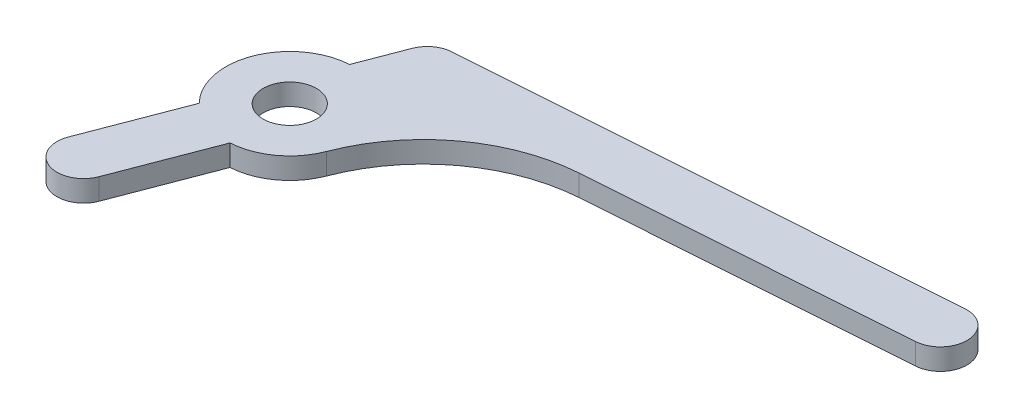
ISO-10303-21;
HEADER;
FILE_DESCRIPTION(('STEP AP214'),'2;1');
FILE_NAME('part.step','',(''),(''),'','','');
FILE_SCHEMA(('AUTOMOTIVE_DESIGN { 1 0 10303 214 1 1 1 1 }'));
ENDSEC;
DATA;
#1=APPLICATION_CONTEXT('core data for automotive mechanical design processes');
#2=APPLICATION_PROTOCOL_DEFINITION('international standard','automotive_design',2000,#1);
#3=PRODUCT_CONTEXT('',#1,'mechanical');
#4=PRODUCT('Part','Part','',(#3));
#5=PRODUCT_RELATED_PRODUCT_CATEGORY('part','',(#4));
#6=PRODUCT_DEFINITION_FORMATION('','',#4);
#7=PRODUCT_DEFINITION_CONTEXT('part definition',#1,'design');
#8=PRODUCT_DEFINITION('design','',#6,#7);
#9=PRODUCT_DEFINITION_SHAPE('','',#8);
#10=(LENGTH_UNIT() NAMED_UNIT(*) SI_UNIT(.MILLI.,.METRE.));
#11=(NAMED_UNIT(*) PLANE_ANGLE_UNIT() SI_UNIT($,.RADIAN.));
#12=(NAMED_UNIT(*) SI_UNIT($,.STERADIAN.) SOLID_ANGLE_UNIT());
#13=UNCERTAINTY_MEASURE_WITH_UNIT(LENGTH_MEASURE(1.E-05),#10,'distance_accuracy_value','');
#14=(GEOMETRIC_REPRESENTATION_CONTEXT(3) GLOBAL_UNCERTAINTY_ASSIGNED_CONTEXT((#13)) GLOBAL_UNIT_ASSIGNED_CONTEXT((#10,
#11,#12)) REPRESENTATION_CONTEXT('',''));
#15=CARTESIAN_POINT('',(0.,0.,0.));
#16=DIRECTION('',(0.,0.,1.));
#17=DIRECTION('',(1.,0.,0.));
#18=AXIS2_PLACEMENT_3D('',#15,#16,#17);
#19=CARTESIAN_POINT('',(-1.04153886954322,2.54,-14.6481268444799));
#20=DIRECTION('',(-0.0709248311990331,0.,-0.997481663149448));
#21=DIRECTION('',(-0.997481663149448,0.,0.0709248311990331));
#22=AXIS2_PLACEMENT_3D('',#19,#20,#21);
#23=PLANE('',#22);
#24=DIRECTION('',(0.997481663149448,0.,-0.0709248311990331));
#25=VECTOR('',#24,1.);
#26=CARTESIAN_POINT('',(-1.04153886954322,0.,-14.6481268444799));
#27=LINE('',#26,#25);
#28=CARTESIAN_POINT('',(4.31219650625697,0.,-15.0287982811999));
#29=VERTEX_POINT('',#28);
#30=CARTESIAN_POINT('',(61.462196506257,0.,-19.0923858665863));
#31=VERTEX_POINT('',#30);
#32=EDGE_CURVE('E155',#29,#31,#27,.T.);
#33=ORIENTED_EDGE('',*,*,#32,.F.);
#34=DIRECTION('',(0.,-1.,0.));
#35=VECTOR('',#34,1.);
#36=CARTESIAN_POINT('',(4.31219650625697,2.54,-15.0287982811999));
#37=LINE('',#36,#35);
#38=CARTESIAN_POINT('',(4.31219650625697,2.54,-15.0287982811999));
#39=VERTEX_POINT('',#38);
#40=EDGE_CURVE('E11',#39,#29,#37,.T.);
#41=ORIENTED_EDGE('',*,*,#40,.F.);
#42=DIRECTION('',(0.997481663149448,0.,-0.0709248311990331));
#43=VECTOR('',#42,1.);
#44=CARTESIAN_POINT('',(-1.04153886954322,2.54,-14.6481268444799));
#45=LINE('',#44,#43);
#46=CARTESIAN_POINT('',(61.462196506257,2.54,-19.0923858665863));
#47=VERTEX_POINT('',#46);
#48=EDGE_CURVE('E183',#39,#47,#45,.T.);
#49=ORIENTED_EDGE('',*,*,#48,.T.);
#50=DIRECTION('',(0.,-1.,0.));
#51=VECTOR('',#50,1.);
#52=CARTESIAN_POINT('',(61.462196506257,2.54,-19.0923858665863));
#53=LINE('',#52,#51);
#54=EDGE_CURVE('E99',#47,#31,#53,.T.);
#55=ORIENTED_EDGE('',*,*,#54,.T.);
#56=EDGE_LOOP('',(#33,#41,#49,#55));
#57=FACE_BOUND('',#56,.T.);
#58=ADVANCED_FACE('F39',(#57),#23,.T.);
#59=CARTESIAN_POINT('',(4.53738284531388,2.54,-11.8617940007004));
#60=DIRECTION('',(0.,-1.,0.));
#61=DIRECTION('',(0.,0.,-1.));
#62=AXIS2_PLACEMENT_3D('',#59,#60,#61);
#63=CYLINDRICAL_SURFACE('',#62,3.175);
#64=CARTESIAN_POINT('',(4.53738284531388,0.,-11.8617940007004));
#65=DIRECTION('',(0.,1.,0.));
#66=DIRECTION('',(0.,0.,1.));
#67=AXIS2_PLACEMENT_3D('',#64,#65,#66);
#68=CIRCLE('',#67,3.175);
#69=CARTESIAN_POINT('',(1.5719343451388,0.,-12.9961397120288));
#70=VERTEX_POINT('',#69);
#71=EDGE_CURVE('E158',#29,#70,#68,.T.);
#72=ORIENTED_EDGE('',*,*,#71,.T.);
#73=DIRECTION('',(0.,-1.,0.));
#74=VECTOR('',#73,1.);
#75=CARTESIAN_POINT('',(1.5719343451388,2.54,-12.9961397120288));
#76=LINE('',#75,#74);
#77=CARTESIAN_POINT('',(1.5719343451388,2.54,-12.9961397120288));
#78=VERTEX_POINT('',#77);
#79=EDGE_CURVE('E47',#78,#70,#76,.T.);
#80=ORIENTED_EDGE('',*,*,#79,.F.);
#81=CARTESIAN_POINT('',(4.53738284531388,2.54,-11.8617940007004));
#82=DIRECTION('',(0.,1.,0.));
#83=DIRECTION('',(0.,0.,1.));
#84=AXIS2_PLACEMENT_3D('',#81,#82,#83);
#85=CIRCLE('',#84,3.175);
#86=EDGE_CURVE('E257',#39,#78,#85,.T.);
#87=ORIENTED_EDGE('',*,*,#86,.F.);
#88=ORIENTED_EDGE('',*,*,#40,.T.);
#89=EDGE_LOOP('',(#72,#80,#87,#88));
#90=FACE_BOUND('',#89,.T.);
#91=ADVANCED_FACE('F207',(#90),#63,.T.);
#92=CARTESIAN_POINT('',(-2.96544850017511,2.54,-1.13434571132848));
#93=DIRECTION('',(-0.933999527614202,0.,-0.357274239788495));
#94=DIRECTION('',(-0.357274239788495,0.,0.933999527614202));
#95=AXIS2_PLACEMENT_3D('',#92,#93,#94);
#96=PLANE('',#95);
#97=DIRECTION('',(0.357274239788495,0.,-0.933999527614202));
#98=VECTOR('',#97,1.);
#99=CARTESIAN_POINT('',(-2.96544850017511,0.,-1.13434571132848));
#100=LINE('',#99,#98);
#101=CARTESIAN_POINT('',(-0.483971480172762,0.,-7.62151468785403));
#102=VERTEX_POINT('',#101);
#103=EDGE_CURVE('E161',#102,#70,#100,.T.);
#104=ORIENTED_EDGE('',*,*,#103,.F.);
#105=DIRECTION('',(0.,-1.,0.));
#106=VECTOR('',#105,1.);
#107=CARTESIAN_POINT('',(-0.483971480172762,2.54,-7.62151468785403));
#108=LINE('',#107,#106);
#109=CARTESIAN_POINT('',(-0.483971480172762,2.54,-7.62151468785403));
#110=VERTEX_POINT('',#109);
#111=EDGE_CURVE('E197',#110,#102,#108,.T.);
#112=ORIENTED_EDGE('',*,*,#111,.F.);
#113=DIRECTION('',(0.357274239788495,0.,-0.933999527614202));
#114=VECTOR('',#113,1.);
#115=CARTESIAN_POINT('',(-2.96544850017511,2.54,-1.13434571132848));
#116=LINE('',#115,#114);
#117=EDGE_CURVE('E204',#110,#78,#116,.T.);
#118=ORIENTED_EDGE('',*,*,#117,.T.);
#119=ORIENTED_EDGE('',*,*,#79,.T.);
#120=EDGE_LOOP('',(#104,#112,#118,#119));
#121=FACE_BOUND('',#120,.T.);
#122=ADVANCED_FACE('F202',(#121),#96,.T.);
#123=CARTESIAN_POINT('',(0.,2.54,0.));
#124=DIRECTION('',(0.,-1.,0.));
#125=DIRECTION('',(0.,0.,-1.));
#126=AXIS2_PLACEMENT_3D('',#123,#124,#125);
#127=CYLINDRICAL_SURFACE('',#126,7.63686549120747);
#128=CARTESIAN_POINT('',(0.,0.,0.));
#129=DIRECTION('',(0.,1.,0.));
#130=DIRECTION('',(0.,0.,1.));
#131=AXIS2_PLACEMENT_3D('',#128,#129,#130);
#132=CIRCLE('',#131,7.63686549120747);
#133=CARTESIAN_POINT('',(-5.44692552017745,0.,5.35282326519709));
#134=VERTEX_POINT('',#133);
#135=EDGE_CURVE('E164',#102,#134,#132,.T.);
#136=ORIENTED_EDGE('',*,*,#135,.T.);
#137=DIRECTION('',(0.,-1.,0.));
#138=VECTOR('',#137,1.);
#139=CARTESIAN_POINT('',(-5.44692552017745,2.54,5.35282326519709));
#140=LINE('',#139,#138);
#141=CARTESIAN_POINT('',(-5.44692552017745,2.54,5.35282326519709));
#142=VERTEX_POINT('',#141);
#143=EDGE_CURVE('E194',#142,#134,#140,.T.);
#144=ORIENTED_EDGE('',*,*,#143,.F.);
#145=CARTESIAN_POINT('',(0.,2.54,0.));
#146=DIRECTION('',(0.,1.,0.));
#147=DIRECTION('',(0.,0.,1.));
#148=AXIS2_PLACEMENT_3D('',#145,#146,#147);
#149=CIRCLE('',#148,7.63686549120747);
#150=EDGE_CURVE('E225',#110,#142,#149,.T.);
#151=ORIENTED_EDGE('',*,*,#150,.F.);
#152=ORIENTED_EDGE('',*,*,#111,.T.);
#153=EDGE_LOOP('',(#136,#144,#151,#152));
#154=FACE_BOUND('',#153,.T.);
#155=ADVANCED_FACE('F216',(#154),#127,.T.);
#156=CARTESIAN_POINT('',(-2.96544850017511,2.54,-1.13434571132848));
#157=DIRECTION('',(0.933999527614202,0.,0.357274239788495));
#158=DIRECTION('',(0.357274239788495,0.,-0.933999527614202));
#159=AXIS2_PLACEMENT_3D('',#156,#157,#158);
#160=PLANE('',#159);
#161=DIRECTION('',(-0.357274239788495,0.,0.933999527614202));
#162=VECTOR('',#161,1.);
#163=CARTESIAN_POINT('',(-2.96544850017511,0.,-1.13434571132848));
#164=LINE('',#163,#162);
#165=CARTESIAN_POINT('',(-9.77152276814594,0.,16.6583452897221));
#166=VERTEX_POINT('',#165);
#167=EDGE_CURVE('E166',#134,#166,#164,.T.);
#168=ORIENTED_EDGE('',*,*,#167,.T.);
#169=DIRECTION('',(0.,-1.,0.));
#170=VECTOR('',#169,1.);
#171=CARTESIAN_POINT('',(-9.77152276814594,2.54,16.6583452897221));
#172=LINE('',#171,#170);
#173=CARTESIAN_POINT('',(-9.77152276814594,2.54,16.6583452897221));
#174=VERTEX_POINT('',#173);
#175=EDGE_CURVE('E191',#174,#166,#172,.T.);
#176=ORIENTED_EDGE('',*,*,#175,.F.);
#177=DIRECTION('',(-0.357274239788495,0.,0.933999527614202));
#178=VECTOR('',#177,1.);
#179=CARTESIAN_POINT('',(-2.96544850017511,2.54,-1.13434571132848));
#180=LINE('',#179,#178);
#181=EDGE_CURVE('E222',#142,#174,#180,.T.);
#182=ORIENTED_EDGE('',*,*,#181,.F.);
#183=ORIENTED_EDGE('',*,*,#143,.T.);
#184=EDGE_LOOP('',(#168,#176,#182,#183));
#185=FACE_BOUND('',#184,.T.);
#186=ADVANCED_FACE('F220',(#185),#160,.F.);
#187=CARTESIAN_POINT('',(-6.80607426797084,2.54,17.7926910010505));
#188=DIRECTION('',(0.,-1.,0.));
#189=DIRECTION('',(0.,0.,-1.));
#190=AXIS2_PLACEMENT_3D('',#187,#188,#189);
#191=CYLINDRICAL_SURFACE('',#190,3.175);
#192=CARTESIAN_POINT('',(-6.80607426797084,0.,17.7926910010505));
#193=DIRECTION('',(0.,1.,0.));
#194=DIRECTION('',(0.,0.,1.));
#195=AXIS2_PLACEMENT_3D('',#192,#193,#194);
#196=CIRCLE('',#195,3.175);
#197=CARTESIAN_POINT('',(-3.84062576779576,0.,18.927036712379));
#198=VERTEX_POINT('',#197);
#199=EDGE_CURVE('E168',#166,#198,#196,.T.);
#200=ORIENTED_EDGE('',*,*,#199,.T.);
#201=DIRECTION('',(0.,-1.,0.));
#202=VECTOR('',#201,1.);
#203=CARTESIAN_POINT('',(-3.84062576779576,2.54,18.927036712379));
#204=LINE('',#203,#202);
#205=CARTESIAN_POINT('',(-3.84062576779576,2.54,18.927036712379));
#206=VERTEX_POINT('',#205);
#207=EDGE_CURVE('E189',#206,#198,#204,.T.);
#208=ORIENTED_EDGE('',*,*,#207,.F.);
#209=CARTESIAN_POINT('',(-6.80607426797084,2.54,17.7926910010505));
#210=DIRECTION('',(0.,1.,0.));
#211=DIRECTION('',(0.,0.,1.));
#212=AXIS2_PLACEMENT_3D('',#209,#210,#211);
#213=CIRCLE('',#212,3.175);
#214=EDGE_CURVE('E224',#174,#206,#213,.T.);
#215=ORIENTED_EDGE('',*,*,#214,.F.);
#216=ORIENTED_EDGE('',*,*,#175,.T.);
#217=EDGE_LOOP('',(#200,#208,#215,#216));
#218=FACE_BOUND('',#217,.T.);
#219=ADVANCED_FACE('F238',(#218),#191,.T.);
#220=CARTESIAN_POINT('',(2.96544850017511,2.54,1.13434571132848));
#221=DIRECTION('',(0.933999527614202,0.,0.357274239788496));
#222=DIRECTION('',(0.357274239788496,0.,-0.933999527614202));
#223=AXIS2_PLACEMENT_3D('',#220,#221,#222);
#224=PLANE('',#223);
#225=DIRECTION('',(-0.357274239788496,0.,0.933999527614202));
#226=VECTOR('',#225,1.);
#227=CARTESIAN_POINT('',(2.96544850017511,0.,1.13434571132848));
#228=LINE('',#227,#226);
#229=CARTESIAN_POINT('',(0.483971480172762,0.,7.62151468785403));
#230=VERTEX_POINT('',#229);
#231=EDGE_CURVE('E171',#230,#198,#228,.T.);
#232=ORIENTED_EDGE('',*,*,#231,.F.);
#233=DIRECTION('',(0.,-1.,0.));
#234=VECTOR('',#233,1.);
#235=CARTESIAN_POINT('',(0.483971480172762,2.54,7.62151468785403));
#236=LINE('',#235,#234);
#237=CARTESIAN_POINT('',(0.483971480172762,2.54,7.62151468785403));
#238=VERTEX_POINT('',#237);
#239=EDGE_CURVE('E187',#238,#230,#236,.T.);
#240=ORIENTED_EDGE('',*,*,#239,.F.);
#241=DIRECTION('',(-0.357274239788496,0.,0.933999527614202));
#242=VECTOR('',#241,1.);
#243=CARTESIAN_POINT('',(2.96544850017511,2.54,1.13434571132848));
#244=LINE('',#243,#242);
#245=EDGE_CURVE('E227',#238,#206,#244,.T.);
#246=ORIENTED_EDGE('',*,*,#245,.T.);
#247=ORIENTED_EDGE('',*,*,#207,.T.);
#248=EDGE_LOOP('',(#232,#240,#246,#247));
#249=FACE_BOUND('',#248,.T.);
#250=ADVANCED_FACE('F235',(#249),#224,.T.);
#251=CARTESIAN_POINT('',(0.,2.54,0.));
#252=DIRECTION('',(0.,-1.,0.));
#253=DIRECTION('',(0.,0.,-1.));
#254=AXIS2_PLACEMENT_3D('',#251,#252,#253);
#255=CYLINDRICAL_SURFACE('',#254,7.63686549120747);
#256=CARTESIAN_POINT('',(0.,0.,0.));
#257=DIRECTION('',(0.,1.,0.));
#258=DIRECTION('',(0.,0.,1.));
#259=AXIS2_PLACEMENT_3D('',#256,#257,#258);
#260=CIRCLE('',#259,7.63686549120747);
#261=CARTESIAN_POINT('',(7.13282876124097,0.,2.72845531273815));
#262=VERTEX_POINT('',#261);
#263=EDGE_CURVE('E174',#230,#262,#260,.T.);
#264=ORIENTED_EDGE('',*,*,#263,.T.);
#265=DIRECTION('',(0.,-1.,0.));
#266=VECTOR('',#265,1.);
#267=CARTESIAN_POINT('',(7.13282876124097,2.54,2.72845531273815));
#268=LINE('',#267,#266);
#269=CARTESIAN_POINT('',(7.13282876124097,2.54,2.72845531273815));
#270=VERTEX_POINT('',#269);
#271=EDGE_CURVE('E144',#270,#262,#268,.T.);
#272=ORIENTED_EDGE('',*,*,#271,.F.);
#273=CARTESIAN_POINT('',(0.,2.54,0.));
#274=DIRECTION('',(0.,1.,0.));
#275=DIRECTION('',(0.,0.,1.));
#276=AXIS2_PLACEMENT_3D('',#273,#274,#275);
#277=CIRCLE('',#276,7.63686549120747);
#278=EDGE_CURVE('E135',#238,#270,#277,.T.);
#279=ORIENTED_EDGE('',*,*,#278,.F.);
#280=ORIENTED_EDGE('',*,*,#239,.T.);
#281=EDGE_LOOP('',(#264,#272,#279,#280));
#282=FACE_BOUND('',#281,.T.);
#283=ADVANCED_FACE('F241',(#282),#255,.T.);
#284=CARTESIAN_POINT('',(25.8370078989676,2.54,9.88319274538853));
#285=DIRECTION('',(0.,-1.,0.));
#286=DIRECTION('',(0.,0.,-1.));
#287=AXIS2_PLACEMENT_3D('',#284,#285,#286);
#288=CYLINDRICAL_SURFACE('',#287,20.0258978561845);
#289=CARTESIAN_POINT('',(25.8370078989676,0.,9.88319274538853));
#290=DIRECTION('',(0.,1.,0.));
#291=DIRECTION('',(0.,0.,1.));
#292=AXIS2_PLACEMENT_3D('',#289,#290,#291);
#293=CIRCLE('',#292,20.0258978561845);
#294=CARTESIAN_POINT('',(24.4166744739086,0.,-10.0922731542594));
#295=VERTEX_POINT('',#294);
#296=EDGE_CURVE('E143',#262,#295,#293,.F.);
#297=ORIENTED_EDGE('',*,*,#296,.T.);
#298=DIRECTION('',(0.,-1.,0.));
#299=VECTOR('',#298,1.);
#300=CARTESIAN_POINT('',(24.4166744739086,2.54,-10.0922731542594));
#301=LINE('',#300,#299);
#302=CARTESIAN_POINT('',(24.4166744739086,2.54,-10.0922731542594));
#303=VERTEX_POINT('',#302);
#304=EDGE_CURVE('E140',#303,#295,#301,.T.);
#305=ORIENTED_EDGE('',*,*,#304,.F.);
#306=CARTESIAN_POINT('',(25.8370078989676,2.54,9.88319274538853));
#307=DIRECTION('',(0.,1.,0.));
#308=DIRECTION('',(0.,0.,1.));
#309=AXIS2_PLACEMENT_3D('',#306,#307,#308);
#310=CIRCLE('',#309,20.0258978561845);
#311=EDGE_CURVE('E127',#270,#303,#310,.F.);
#312=ORIENTED_EDGE('',*,*,#311,.F.);
#313=ORIENTED_EDGE('',*,*,#271,.T.);
#314=EDGE_LOOP('',(#297,#305,#312,#313));
#315=FACE_BOUND('',#314,.T.);
#316=ADVANCED_FACE('F141',(#315),#288,.F.);
#317=CARTESIAN_POINT('',(-0.591166191429349,2.54,-8.31411828348091));
#318=DIRECTION('',(-0.070924831199033,0.,-0.997481663149448));
#319=DIRECTION('',(-0.997481663149448,0.,0.070924831199033));
#320=AXIS2_PLACEMENT_3D('',#317,#318,#319);
#321=PLANE('',#320);
#322=DIRECTION('',(0.997481663149448,0.,-0.070924831199033));
#323=VECTOR('',#322,1.);
#324=CARTESIAN_POINT('',(-0.591166191429349,0.,-8.31411828348091));
#325=LINE('',#324,#323);
#326=CARTESIAN_POINT('',(61.9125691843708,0.,-12.7583773055873));
#327=VERTEX_POINT('',#326);
#328=EDGE_CURVE('E92',#295,#327,#325,.T.);
#329=ORIENTED_EDGE('',*,*,#328,.T.);
#330=DIRECTION('',(0.,-1.,0.));
#331=VECTOR('',#330,1.);
#332=CARTESIAN_POINT('',(61.9125691843708,2.54,-12.7583773055873));
#333=LINE('',#332,#331);
#334=CARTESIAN_POINT('',(61.9125691843708,2.54,-12.7583773055873));
#335=VERTEX_POINT('',#334);
#336=EDGE_CURVE('E145',#335,#327,#333,.T.);
#337=ORIENTED_EDGE('',*,*,#336,.F.);
#338=DIRECTION('',(0.997481663149448,0.,-0.070924831199033));
#339=VECTOR('',#338,1.);
#340=CARTESIAN_POINT('',(-0.591166191429349,2.54,-8.31411828348091));
#341=LINE('',#340,#339);
#342=EDGE_CURVE('E132',#303,#335,#341,.T.);
#343=ORIENTED_EDGE('',*,*,#342,.F.);
#344=ORIENTED_EDGE('',*,*,#304,.T.);
#345=EDGE_LOOP('',(#329,#337,#343,#344));
#346=FACE_BOUND('',#345,.T.);
#347=ADVANCED_FACE('F147',(#346),#321,.F.);
#348=CARTESIAN_POINT('',(61.6873828453139,2.54,-15.9253815860868));
#349=DIRECTION('',(0.,-1.,0.));
#350=DIRECTION('',(0.,0.,-1.));
#351=AXIS2_PLACEMENT_3D('',#348,#349,#350);
#352=CYLINDRICAL_SURFACE('',#351,3.17499999999999);
#353=CARTESIAN_POINT('',(61.6873828453139,0.,-15.9253815860868));
#354=DIRECTION('',(0.,1.,0.));
#355=DIRECTION('',(0.,0.,1.));
#356=AXIS2_PLACEMENT_3D('',#353,#354,#355);
#357=CIRCLE('',#356,3.17499999999999);
#358=EDGE_CURVE('E178',#327,#31,#357,.T.);
#359=ORIENTED_EDGE('',*,*,#358,.T.);
#360=ORIENTED_EDGE('',*,*,#54,.F.);
#361=CARTESIAN_POINT('',(61.6873828453139,2.54,-15.9253815860868));
#362=DIRECTION('',(0.,1.,0.));
#363=DIRECTION('',(0.,0.,1.));
#364=AXIS2_PLACEMENT_3D('',#361,#362,#363);
#365=CIRCLE('',#364,3.17499999999999);
#366=EDGE_CURVE('E55',#335,#47,#365,.T.);
#367=ORIENTED_EDGE('',*,*,#366,.F.);
#368=ORIENTED_EDGE('',*,*,#336,.T.);
#369=EDGE_LOOP('',(#359,#360,#367,#368));
#370=FACE_BOUND('',#369,.T.);
#371=ADVANCED_FACE('F256',(#370),#352,.T.);
#372=CARTESIAN_POINT('',(0.,2.54,0.));
#373=DIRECTION('',(0.,-1.,0.));
#374=DIRECTION('',(0.,0.,-1.));
#375=AXIS2_PLACEMENT_3D('',#372,#373,#374);
#376=CYLINDRICAL_SURFACE('',#375,3.175);
#377=CARTESIAN_POINT('',(0.,2.54,0.));
#378=DIRECTION('',(0.,1.,0.));
#379=DIRECTION('',(0.,0.,1.));
#380=AXIS2_PLACEMENT_3D('',#377,#378,#379);
#381=CIRCLE('',#380,3.175);
#382=CARTESIAN_POINT('',(0.,2.54,3.175));
#383=VERTEX_POINT('',#382);
#384=EDGE_CURVE('E149',#383,#383,#381,.T.);
#385=ORIENTED_EDGE('',*,*,#384,.T.);
#386=EDGE_LOOP('',(#385));
#387=FACE_BOUND('',#386,.T.);
#388=CARTESIAN_POINT('',(0.,0.,0.));
#389=DIRECTION('',(0.,1.,0.));
#390=DIRECTION('',(0.,0.,1.));
#391=AXIS2_PLACEMENT_3D('',#388,#389,#390);
#392=CIRCLE('',#391,3.175);
#393=CARTESIAN_POINT('',(0.,0.,3.175));
#394=VERTEX_POINT('',#393);
#395=EDGE_CURVE('E180',#394,#394,#392,.T.);
#396=ORIENTED_EDGE('',*,*,#395,.F.);
#397=EDGE_LOOP('',(#396));
#398=FACE_BOUND('',#397,.T.);
#399=ADVANCED_FACE('F261',(#387,#398),#376,.F.);
#400=CARTESIAN_POINT('',(0.,2.54,0.));
#401=DIRECTION('',(0.,1.,0.));
#402=DIRECTION('',(0.,0.,1.));
#403=AXIS2_PLACEMENT_3D('',#400,#401,#402);
#404=PLANE('',#403);
#405=ORIENTED_EDGE('',*,*,#48,.F.);
#406=ORIENTED_EDGE('',*,*,#86,.T.);
#407=ORIENTED_EDGE('',*,*,#117,.F.);
#408=ORIENTED_EDGE('',*,*,#150,.T.);
#409=ORIENTED_EDGE('',*,*,#181,.T.);
#410=ORIENTED_EDGE('',*,*,#214,.T.);
#411=ORIENTED_EDGE('',*,*,#245,.F.);
#412=ORIENTED_EDGE('',*,*,#278,.T.);
#413=ORIENTED_EDGE('',*,*,#311,.T.);
#414=ORIENTED_EDGE('',*,*,#342,.T.);
#415=ORIENTED_EDGE('',*,*,#366,.T.);
#416=EDGE_LOOP('',(#405,#406,#407,#408,#409,#410,#411,#412,#413,#414,#415));
#417=FACE_BOUND('',#416,.T.);
#418=ORIENTED_EDGE('',*,*,#384,.F.);
#419=EDGE_LOOP('',(#418));
#420=FACE_BOUND('',#419,.T.);
#421=ADVANCED_FACE('F129',(#417,#420),#404,.T.);
#422=CARTESIAN_POINT('',(0.,0.,0.));
#423=DIRECTION('',(0.,1.,0.));
#424=DIRECTION('',(0.,0.,1.));
#425=AXIS2_PLACEMENT_3D('',#422,#423,#424);
#426=PLANE('',#425);
#427=ORIENTED_EDGE('',*,*,#32,.T.);
#428=ORIENTED_EDGE('',*,*,#358,.F.);
#429=ORIENTED_EDGE('',*,*,#328,.F.);
#430=ORIENTED_EDGE('',*,*,#296,.F.);
#431=ORIENTED_EDGE('',*,*,#263,.F.);
#432=ORIENTED_EDGE('',*,*,#231,.T.);
#433=ORIENTED_EDGE('',*,*,#199,.F.);
#434=ORIENTED_EDGE('',*,*,#167,.F.);
#435=ORIENTED_EDGE('',*,*,#135,.F.);
#436=ORIENTED_EDGE('',*,*,#103,.T.);
#437=ORIENTED_EDGE('',*,*,#71,.F.);
#438=EDGE_LOOP('',(#427,#428,#429,#430,#431,#432,#433,#434,#435,#436,#437));
#439=FACE_BOUND('',#438,.T.);
#440=ORIENTED_EDGE('',*,*,#395,.T.);
#441=EDGE_LOOP('',(#440));
#442=FACE_BOUND('',#441,.T.);
#443=ADVANCED_FACE('F210',(#439,#442),#426,.F.);
#444=CLOSED_SHELL('',(#58,#91,#122,#155,#186,#219,#250,#283,#316,#347,#371,#399,#421,#443));
#445=MANIFOLD_SOLID_BREP('B2',#444);
#446=ADVANCED_BREP_SHAPE_REPRESENTATION('',(#18,#445),#14);
#447=SHAPE_DEFINITION_REPRESENTATION(#9,#446);
ENDSEC;
END-ISO-10303-21;
